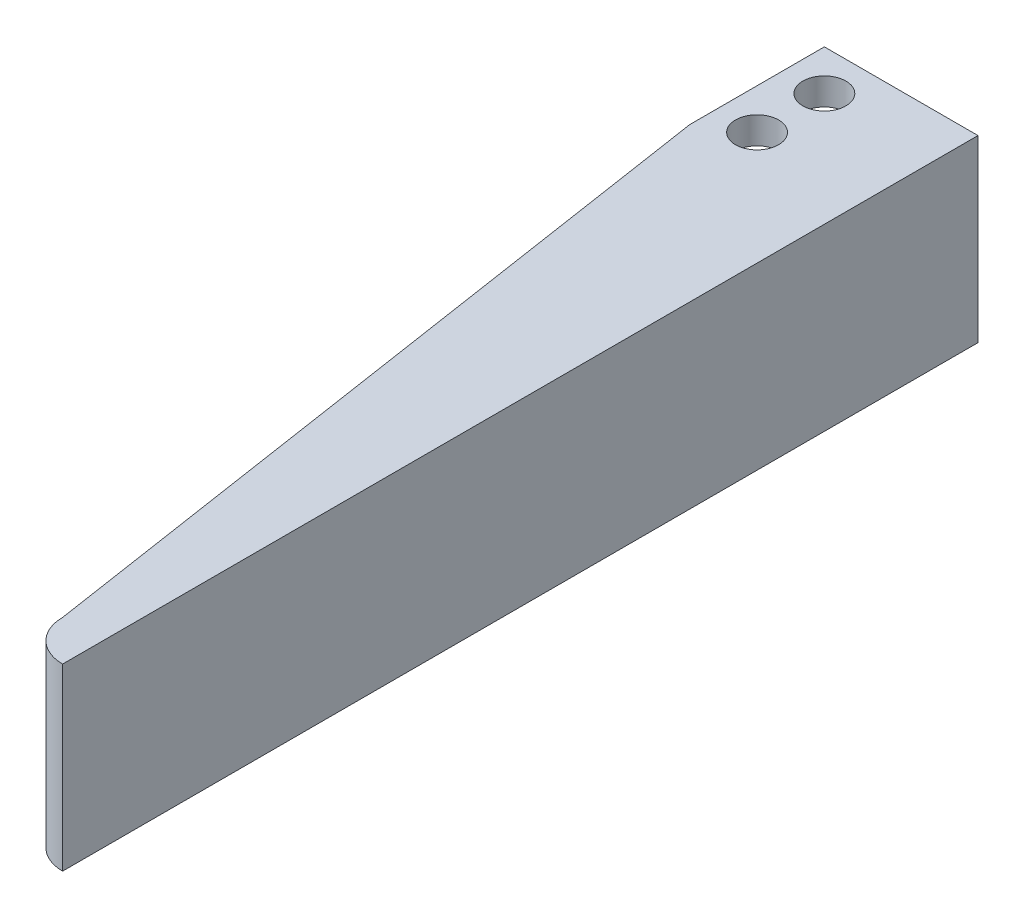
ISO-10303-21;
HEADER;
FILE_DESCRIPTION(('STEP AP214'),'2;1');
FILE_NAME('part.step','',(''),(''),'','','');
FILE_SCHEMA(('AUTOMOTIVE_DESIGN { 1 0 10303 214 1 1 1 1 }'));
ENDSEC;
DATA;
#1=APPLICATION_CONTEXT('core data for automotive mechanical design processes');
#2=APPLICATION_PROTOCOL_DEFINITION('international standard','automotive_design',2000,#1);
#3=PRODUCT_CONTEXT('',#1,'mechanical');
#4=PRODUCT('Part','Part','',(#3));
#5=PRODUCT_RELATED_PRODUCT_CATEGORY('part','',(#4));
#6=PRODUCT_DEFINITION_FORMATION('','',#4);
#7=PRODUCT_DEFINITION_CONTEXT('part definition',#1,'design');
#8=PRODUCT_DEFINITION('design','',#6,#7);
#9=PRODUCT_DEFINITION_SHAPE('','',#8);
#10=(LENGTH_UNIT() NAMED_UNIT(*) SI_UNIT(.MILLI.,.METRE.));
#11=(NAMED_UNIT(*) PLANE_ANGLE_UNIT() SI_UNIT($,.RADIAN.));
#12=(NAMED_UNIT(*) SI_UNIT($,.STERADIAN.) SOLID_ANGLE_UNIT());
#13=UNCERTAINTY_MEASURE_WITH_UNIT(LENGTH_MEASURE(1.E-05),#10,'distance_accuracy_value','');
#14=(GEOMETRIC_REPRESENTATION_CONTEXT(3) GLOBAL_UNCERTAINTY_ASSIGNED_CONTEXT((#13)) GLOBAL_UNIT_ASSIGNED_CONTEXT((#10,
#11,#12)) REPRESENTATION_CONTEXT('',''));
#15=CARTESIAN_POINT('',(0.,0.,0.));
#16=DIRECTION('',(0.,0.,1.));
#17=DIRECTION('',(1.,0.,0.));
#18=AXIS2_PLACEMENT_3D('',#15,#16,#17);
#19=CARTESIAN_POINT('',(5.70625000000002,0.,65.));
#20=DIRECTION('',(0.,1.,0.));
#21=DIRECTION('',(0.,0.,1.));
#22=AXIS2_PLACEMENT_3D('',#19,#20,#21);
#23=PLANE('',#22);
#24=CARTESIAN_POINT('',(-2.70625,0.,8.));
#25=DIRECTION('',(0.,1.,0.));
#26=DIRECTION('',(0.,0.,1.));
#27=AXIS2_PLACEMENT_3D('',#24,#25,#26);
#28=CIRCLE('',#27,1.6);
#29=CARTESIAN_POINT('',(-2.70625,0.,9.6));
#30=VERTEX_POINT('',#29);
#31=EDGE_CURVE('E136',#30,#30,#28,.T.);
#32=ORIENTED_EDGE('',*,*,#31,.T.);
#33=EDGE_LOOP('',(#32));
#34=FACE_BOUND('',#33,.T.);
#35=CARTESIAN_POINT('',(-2.70625,0.,3.));
#36=DIRECTION('',(0.,1.,0.));
#37=DIRECTION('',(0.,0.,1.));
#38=AXIS2_PLACEMENT_3D('',#35,#36,#37);
#39=CIRCLE('',#38,1.6);
#40=CARTESIAN_POINT('',(-2.70625,0.,4.6));
#41=VERTEX_POINT('',#40);
#42=EDGE_CURVE('E146',#41,#41,#39,.T.);
#43=ORIENTED_EDGE('',*,*,#42,.T.);
#44=EDGE_LOOP('',(#43));
#45=FACE_BOUND('',#44,.T.);
#46=DIRECTION('',(0.,0.,-1.));
#47=VECTOR('',#46,1.);
#48=CARTESIAN_POINT('',(2.70625000000002,0.,65.));
#49=LINE('',#48,#47);
#50=CARTESIAN_POINT('',(2.70625000000002,0.,65.));
#51=VERTEX_POINT('',#50);
#52=CARTESIAN_POINT('',(2.70625000000003,0.,0.));
#53=VERTEX_POINT('',#52);
#54=EDGE_CURVE('E66',#51,#53,#49,.T.);
#55=ORIENTED_EDGE('',*,*,#54,.F.);
#56=DIRECTION('',(0.151196146520445,0.,0.988503781114351));
#57=VECTOR('',#56,1.);
#58=CARTESIAN_POINT('',(-5.70625,0.,10.));
#59=LINE('',#58,#57);
#60=CARTESIAN_POINT('',(-5.70625,0.,10.));
#61=VERTEX_POINT('',#60);
#62=EDGE_CURVE('E119',#61,#51,#59,.T.);
#63=ORIENTED_EDGE('',*,*,#62,.F.);
#64=DIRECTION('',(0.,0.,1.));
#65=VECTOR('',#64,1.);
#66=CARTESIAN_POINT('',(-5.70625,0.,0.));
#67=LINE('',#66,#65);
#68=CARTESIAN_POINT('',(-5.70625,0.,0.));
#69=VERTEX_POINT('',#68);
#70=EDGE_CURVE('E116',#69,#61,#67,.T.);
#71=ORIENTED_EDGE('',*,*,#70,.F.);
#72=DIRECTION('',(-1.,0.,0.));
#73=VECTOR('',#72,1.);
#74=CARTESIAN_POINT('',(-5.70625,0.,0.));
#75=LINE('',#74,#73);
#76=EDGE_CURVE('E72',#53,#69,#75,.T.);
#77=ORIENTED_EDGE('',*,*,#76,.F.);
#78=EDGE_LOOP('',(#55,#63,#71,#77));
#79=FACE_BOUND('',#78,.T.);
#80=ADVANCED_FACE('F35',(#34,#45,#79),#23,.F.);
#81=CARTESIAN_POINT('',(5.70625000000002,2.,65.));
#82=DIRECTION('',(0.,1.,0.));
#83=DIRECTION('',(0.,0.,1.));
#84=AXIS2_PLACEMENT_3D('',#81,#82,#83);
#85=PLANE('',#84);
#86=CARTESIAN_POINT('',(-2.70625,2.,3.));
#87=DIRECTION('',(0.,1.,0.));
#88=DIRECTION('',(0.,0.,1.));
#89=AXIS2_PLACEMENT_3D('',#86,#87,#88);
#90=CIRCLE('',#89,1.6);
#91=CARTESIAN_POINT('',(-2.70625,2.,4.6));
#92=VERTEX_POINT('',#91);
#93=EDGE_CURVE('E120',#92,#92,#90,.T.);
#94=ORIENTED_EDGE('',*,*,#93,.F.);
#95=EDGE_LOOP('',(#94));
#96=FACE_BOUND('',#95,.T.);
#97=DIRECTION('',(0.,0.,1.));
#98=VECTOR('',#97,1.);
#99=CARTESIAN_POINT('',(-5.70625,2.,0.));
#100=LINE('',#99,#98);
#101=CARTESIAN_POINT('',(-5.70625,2.,0.));
#102=VERTEX_POINT('',#101);
#103=CARTESIAN_POINT('',(-5.70625,2.,10.));
#104=VERTEX_POINT('',#103);
#105=EDGE_CURVE('E123',#102,#104,#100,.T.);
#106=ORIENTED_EDGE('',*,*,#105,.T.);
#107=DIRECTION('',(0.151196146520445,0.,0.988503781114351));
#108=VECTOR('',#107,1.);
#109=CARTESIAN_POINT('',(-5.70625,2.,10.));
#110=LINE('',#109,#108);
#111=CARTESIAN_POINT('',(2.70625000000002,2.,65.));
#112=VERTEX_POINT('',#111);
#113=EDGE_CURVE('E80',#104,#112,#110,.T.);
#114=ORIENTED_EDGE('',*,*,#113,.T.);
#115=CARTESIAN_POINT('',(5.70625000000002,2.,65.));
#116=DIRECTION('',(0.,1.,0.));
#117=DIRECTION('',(0.,0.,1.));
#118=AXIS2_PLACEMENT_3D('',#115,#116,#117);
#119=CIRCLE('',#118,3.);
#120=CARTESIAN_POINT('',(5.70625000000001,2.,68.));
#121=VERTEX_POINT('',#120);
#122=EDGE_CURVE('E86',#112,#121,#119,.T.);
#123=ORIENTED_EDGE('',*,*,#122,.T.);
#124=DIRECTION('',(0.,0.,-1.));
#125=VECTOR('',#124,1.);
#126=CARTESIAN_POINT('',(5.70625000000001,2.,68.));
#127=LINE('',#126,#125);
#128=CARTESIAN_POINT('',(5.70625,2.,0.));
#129=VERTEX_POINT('',#128);
#130=EDGE_CURVE('E91',#121,#129,#127,.T.);
#131=ORIENTED_EDGE('',*,*,#130,.T.);
#132=DIRECTION('',(-1.,0.,0.));
#133=VECTOR('',#132,1.);
#134=CARTESIAN_POINT('',(-5.70625,2.,0.));
#135=LINE('',#134,#133);
#136=EDGE_CURVE('E52',#129,#102,#135,.T.);
#137=ORIENTED_EDGE('',*,*,#136,.T.);
#138=EDGE_LOOP('',(#106,#114,#123,#131,#137));
#139=FACE_BOUND('',#138,.T.);
#140=CARTESIAN_POINT('',(-2.70625,2.,8.));
#141=DIRECTION('',(0.,1.,0.));
#142=DIRECTION('',(0.,0.,1.));
#143=AXIS2_PLACEMENT_3D('',#140,#141,#142);
#144=CIRCLE('',#143,1.6);
#145=CARTESIAN_POINT('',(-2.70625,2.,9.6));
#146=VERTEX_POINT('',#145);
#147=EDGE_CURVE('E140',#146,#146,#144,.T.);
#148=ORIENTED_EDGE('',*,*,#147,.F.);
#149=EDGE_LOOP('',(#148));
#150=FACE_BOUND('',#149,.T.);
#151=ADVANCED_FACE('F88',(#96,#139,#150),#85,.T.);
#152=CARTESIAN_POINT('',(-5.70625,2.,0.));
#153=DIRECTION('',(1.,0.,0.));
#154=DIRECTION('',(0.,0.,-1.));
#155=AXIS2_PLACEMENT_3D('',#152,#153,#154);
#156=PLANE('',#155);
#157=ORIENTED_EDGE('',*,*,#70,.T.);
#158=DIRECTION('',(0.,-1.,0.));
#159=VECTOR('',#158,1.);
#160=CARTESIAN_POINT('',(-5.70625,2.,10.));
#161=LINE('',#160,#159);
#162=EDGE_CURVE('E11',#104,#61,#161,.T.);
#163=ORIENTED_EDGE('',*,*,#162,.F.);
#164=ORIENTED_EDGE('',*,*,#105,.F.);
#165=DIRECTION('',(0.,-1.,0.));
#166=VECTOR('',#165,1.);
#167=CARTESIAN_POINT('',(-5.70625,2.,0.));
#168=LINE('',#167,#166);
#169=EDGE_CURVE('E112',#102,#69,#168,.T.);
#170=ORIENTED_EDGE('',*,*,#169,.T.);
#171=EDGE_LOOP('',(#157,#163,#164,#170));
#172=FACE_BOUND('',#171,.T.);
#173=ADVANCED_FACE('F37',(#172),#156,.F.);
#174=CARTESIAN_POINT('',(-5.70625,2.,10.));
#175=DIRECTION('',(0.988503781114351,0.,-0.151196146520445));
#176=DIRECTION('',(-0.151196146520445,0.,-0.988503781114351));
#177=AXIS2_PLACEMENT_3D('',#174,#175,#176);
#178=PLANE('',#177);
#179=ORIENTED_EDGE('',*,*,#62,.T.);
#180=DIRECTION('',(0.,-1.,0.));
#181=VECTOR('',#180,1.);
#182=CARTESIAN_POINT('',(2.70625000000002,2.,65.));
#183=LINE('',#182,#181);
#184=EDGE_CURVE('E44',#112,#51,#183,.T.);
#185=ORIENTED_EDGE('',*,*,#184,.F.);
#186=ORIENTED_EDGE('',*,*,#113,.F.);
#187=ORIENTED_EDGE('',*,*,#162,.T.);
#188=EDGE_LOOP('',(#179,#185,#186,#187));
#189=FACE_BOUND('',#188,.T.);
#190=ADVANCED_FACE('F156',(#189),#178,.F.);
#191=CARTESIAN_POINT('',(5.70625000000002,2.,65.));
#192=DIRECTION('',(0.,-1.,0.));
#193=DIRECTION('',(0.,0.,-1.));
#194=AXIS2_PLACEMENT_3D('',#191,#192,#193);
#195=CYLINDRICAL_SURFACE('',#194,3.);
#196=ORIENTED_EDGE('',*,*,#184,.T.);
#197=DIRECTION('',(0.,1.,0.));
#198=VECTOR('',#197,1.);
#199=CARTESIAN_POINT('',(2.70625000000002,-4.6625,65.));
#200=LINE('',#199,#198);
#201=CARTESIAN_POINT('',(2.70625000000002,-9.325,65.));
#202=VERTEX_POINT('',#201);
#203=EDGE_CURVE('E128',#202,#51,#200,.T.);
#204=ORIENTED_EDGE('',*,*,#203,.F.);
#205=DIRECTION('',(0.,1.,0.));
#206=VECTOR('',#205,1.);
#207=CARTESIAN_POINT('',(2.70625000000002,-11.325,65.));
#208=LINE('',#207,#206);
#209=CARTESIAN_POINT('',(2.70625000000002,-11.325,65.));
#210=VERTEX_POINT('',#209);
#211=EDGE_CURVE('E189',#210,#202,#208,.T.);
#212=ORIENTED_EDGE('',*,*,#211,.F.);
#213=CARTESIAN_POINT('',(5.70625000000002,-11.325,65.));
#214=DIRECTION('',(0.,1.,0.));
#215=DIRECTION('',(0.,0.,1.));
#216=AXIS2_PLACEMENT_3D('',#213,#214,#215);
#217=CIRCLE('',#216,3.);
#218=CARTESIAN_POINT('',(5.70625000000001,-11.325,68.));
#219=VERTEX_POINT('',#218);
#220=EDGE_CURVE('E103',#210,#219,#217,.T.);
#221=ORIENTED_EDGE('',*,*,#220,.T.);
#222=DIRECTION('',(0.,-1.,0.));
#223=VECTOR('',#222,1.);
#224=CARTESIAN_POINT('',(5.70625000000001,2.,68.));
#225=LINE('',#224,#223);
#226=EDGE_CURVE('E98',#121,#219,#225,.T.);
#227=ORIENTED_EDGE('',*,*,#226,.F.);
#228=ORIENTED_EDGE('',*,*,#122,.F.);
#229=EDGE_LOOP('',(#196,#204,#212,#221,#227,#228));
#230=FACE_BOUND('',#229,.T.);
#231=ADVANCED_FACE('F99',(#230),#195,.T.);
#232=CARTESIAN_POINT('',(5.70625000000001,2.,68.));
#233=DIRECTION('',(-1.,0.,0.));
#234=DIRECTION('',(0.,0.,1.));
#235=AXIS2_PLACEMENT_3D('',#232,#233,#234);
#236=PLANE('',#235);
#237=ORIENTED_EDGE('',*,*,#226,.T.);
#238=DIRECTION('',(0.,0.,-1.));
#239=VECTOR('',#238,1.);
#240=CARTESIAN_POINT('',(5.70625000000001,-11.325,68.));
#241=LINE('',#240,#239);
#242=CARTESIAN_POINT('',(5.70625,-11.325,0.));
#243=VERTEX_POINT('',#242);
#244=EDGE_CURVE('E200',#219,#243,#241,.T.);
#245=ORIENTED_EDGE('',*,*,#244,.T.);
#246=DIRECTION('',(0.,-1.,0.));
#247=VECTOR('',#246,1.);
#248=CARTESIAN_POINT('',(5.70625,2.,0.));
#249=LINE('',#248,#247);
#250=EDGE_CURVE('E107',#129,#243,#249,.T.);
#251=ORIENTED_EDGE('',*,*,#250,.F.);
#252=ORIENTED_EDGE('',*,*,#130,.F.);
#253=EDGE_LOOP('',(#237,#245,#251,#252));
#254=FACE_BOUND('',#253,.T.);
#255=ADVANCED_FACE('F109',(#254),#236,.F.);
#256=CARTESIAN_POINT('',(-5.70625,2.,0.));
#257=DIRECTION('',(0.,0.,1.));
#258=DIRECTION('',(1.,0.,0.));
#259=AXIS2_PLACEMENT_3D('',#256,#257,#258);
#260=PLANE('',#259);
#261=ORIENTED_EDGE('',*,*,#250,.T.);
#262=DIRECTION('',(-1.,0.,0.));
#263=VECTOR('',#262,1.);
#264=CARTESIAN_POINT('',(-5.70625,-11.325,0.));
#265=LINE('',#264,#263);
#266=CARTESIAN_POINT('',(-5.70625,-11.325,0.));
#267=VERTEX_POINT('',#266);
#268=EDGE_CURVE('E194',#243,#267,#265,.T.);
#269=ORIENTED_EDGE('',*,*,#268,.T.);
#270=DIRECTION('',(0.,1.,0.));
#271=VECTOR('',#270,1.);
#272=CARTESIAN_POINT('',(-5.70625,-11.325,0.));
#273=LINE('',#272,#271);
#274=CARTESIAN_POINT('',(-5.70625,-9.325,0.));
#275=VERTEX_POINT('',#274);
#276=EDGE_CURVE('E180',#267,#275,#273,.T.);
#277=ORIENTED_EDGE('',*,*,#276,.T.);
#278=DIRECTION('',(-1.,0.,0.));
#279=VECTOR('',#278,1.);
#280=CARTESIAN_POINT('',(-5.70625,-9.325,0.));
#281=LINE('',#280,#279);
#282=CARTESIAN_POINT('',(2.70625000000002,-9.325,0.));
#283=VERTEX_POINT('',#282);
#284=EDGE_CURVE('E209',#283,#275,#281,.T.);
#285=ORIENTED_EDGE('',*,*,#284,.F.);
#286=DIRECTION('',(0.,1.,0.));
#287=VECTOR('',#286,1.);
#288=CARTESIAN_POINT('',(2.70625000000003,-4.6625,0.));
#289=LINE('',#288,#287);
#290=EDGE_CURVE('E137',#283,#53,#289,.T.);
#291=ORIENTED_EDGE('',*,*,#290,.T.);
#292=ORIENTED_EDGE('',*,*,#76,.T.);
#293=ORIENTED_EDGE('',*,*,#169,.F.);
#294=ORIENTED_EDGE('',*,*,#136,.F.);
#295=EDGE_LOOP('',(#261,#269,#277,#285,#291,#292,#293,#294));
#296=FACE_BOUND('',#295,.T.);
#297=ADVANCED_FACE('F199',(#296),#260,.F.);
#298=CARTESIAN_POINT('',(-2.70625,2.,3.));
#299=DIRECTION('',(0.,-1.,0.));
#300=DIRECTION('',(0.,0.,-1.));
#301=AXIS2_PLACEMENT_3D('',#298,#299,#300);
#302=CYLINDRICAL_SURFACE('',#301,1.6);
#303=ORIENTED_EDGE('',*,*,#93,.T.);
#304=EDGE_LOOP('',(#303));
#305=FACE_BOUND('',#304,.T.);
#306=ORIENTED_EDGE('',*,*,#42,.F.);
#307=EDGE_LOOP('',(#306));
#308=FACE_BOUND('',#307,.T.);
#309=ADVANCED_FACE('F245',(#305,#308),#302,.F.);
#310=CARTESIAN_POINT('',(-2.70625,2.,8.));
#311=DIRECTION('',(0.,-1.,0.));
#312=DIRECTION('',(0.,0.,-1.));
#313=AXIS2_PLACEMENT_3D('',#310,#311,#312);
#314=CYLINDRICAL_SURFACE('',#313,1.6);
#315=ORIENTED_EDGE('',*,*,#147,.T.);
#316=EDGE_LOOP('',(#315));
#317=FACE_BOUND('',#316,.T.);
#318=ORIENTED_EDGE('',*,*,#31,.F.);
#319=EDGE_LOOP('',(#318));
#320=FACE_BOUND('',#319,.T.);
#321=ADVANCED_FACE('F299',(#317,#320),#314,.F.);
#322=CARTESIAN_POINT('',(2.70625000000002,-4.6625,65.));
#323=DIRECTION('',(1.,0.,0.));
#324=DIRECTION('',(0.,0.,-1.));
#325=AXIS2_PLACEMENT_3D('',#322,#323,#324);
#326=PLANE('',#325);
#327=ORIENTED_EDGE('',*,*,#54,.T.);
#328=ORIENTED_EDGE('',*,*,#290,.F.);
#329=DIRECTION('',(0.,0.,-1.));
#330=VECTOR('',#329,1.);
#331=CARTESIAN_POINT('',(2.70625000000002,-9.325,65.));
#332=LINE('',#331,#330);
#333=EDGE_CURVE('E134',#202,#283,#332,.T.);
#334=ORIENTED_EDGE('',*,*,#333,.F.);
#335=ORIENTED_EDGE('',*,*,#203,.T.);
#336=EDGE_LOOP('',(#327,#328,#334,#335));
#337=FACE_BOUND('',#336,.T.);
#338=ADVANCED_FACE('F131',(#337),#326,.F.);
#339=CARTESIAN_POINT('',(5.70625000000002,-9.325,65.));
#340=DIRECTION('',(0.,-1.,0.));
#341=DIRECTION('',(0.,0.,1.));
#342=AXIS2_PLACEMENT_3D('',#339,#340,#341);
#343=PLANE('',#342);
#344=CARTESIAN_POINT('',(-2.70625,-9.325,8.));
#345=DIRECTION('',(0.,1.,0.));
#346=DIRECTION('',(0.,0.,1.));
#347=AXIS2_PLACEMENT_3D('',#344,#345,#346);
#348=CIRCLE('',#347,1.6);
#349=CARTESIAN_POINT('',(-2.70625,-9.325,9.6));
#350=VERTEX_POINT('',#349);
#351=EDGE_CURVE('E368',#350,#350,#348,.T.);
#352=ORIENTED_EDGE('',*,*,#351,.F.);
#353=EDGE_LOOP('',(#352));
#354=FACE_BOUND('',#353,.T.);
#355=CARTESIAN_POINT('',(-2.70625,-9.325,3.));
#356=DIRECTION('',(0.,1.,0.));
#357=DIRECTION('',(0.,0.,1.));
#358=AXIS2_PLACEMENT_3D('',#355,#356,#357);
#359=CIRCLE('',#358,1.6);
#360=CARTESIAN_POINT('',(-2.70625,-9.325,4.6));
#361=VERTEX_POINT('',#360);
#362=EDGE_CURVE('E370',#361,#361,#359,.T.);
#363=ORIENTED_EDGE('',*,*,#362,.F.);
#364=EDGE_LOOP('',(#363));
#365=FACE_BOUND('',#364,.T.);
#366=DIRECTION('',(0.151196146520445,0.,0.988503781114351));
#367=VECTOR('',#366,1.);
#368=CARTESIAN_POINT('',(-5.70625,-9.325,10.));
#369=LINE('',#368,#367);
#370=CARTESIAN_POINT('',(-5.70625,-9.325,10.));
#371=VERTEX_POINT('',#370);
#372=EDGE_CURVE('E197',#371,#202,#369,.T.);
#373=ORIENTED_EDGE('',*,*,#372,.T.);
#374=ORIENTED_EDGE('',*,*,#333,.T.);
#375=ORIENTED_EDGE('',*,*,#284,.T.);
#376=DIRECTION('',(0.,0.,1.));
#377=VECTOR('',#376,1.);
#378=CARTESIAN_POINT('',(-5.70625,-9.325,0.));
#379=LINE('',#378,#377);
#380=EDGE_CURVE('E186',#275,#371,#379,.T.);
#381=ORIENTED_EDGE('',*,*,#380,.T.);
#382=EDGE_LOOP('',(#373,#374,#375,#381));
#383=FACE_BOUND('',#382,.T.);
#384=ADVANCED_FACE('F217',(#354,#365,#383),#343,.F.);
#385=CARTESIAN_POINT('',(-5.70625,-11.325,0.));
#386=DIRECTION('',(-1.,0.,0.));
#387=DIRECTION('',(0.,0.,1.));
#388=AXIS2_PLACEMENT_3D('',#385,#386,#387);
#389=PLANE('',#388);
#390=ORIENTED_EDGE('',*,*,#380,.F.);
#391=ORIENTED_EDGE('',*,*,#276,.F.);
#392=DIRECTION('',(0.,0.,1.));
#393=VECTOR('',#392,1.);
#394=CARTESIAN_POINT('',(-5.70625,-11.325,0.));
#395=LINE('',#394,#393);
#396=CARTESIAN_POINT('',(-5.70625,-11.325,10.));
#397=VERTEX_POINT('',#396);
#398=EDGE_CURVE('E183',#267,#397,#395,.T.);
#399=ORIENTED_EDGE('',*,*,#398,.T.);
#400=DIRECTION('',(0.,1.,0.));
#401=VECTOR('',#400,1.);
#402=CARTESIAN_POINT('',(-5.70625,-11.325,10.));
#403=LINE('',#402,#401);
#404=EDGE_CURVE('E207',#397,#371,#403,.T.);
#405=ORIENTED_EDGE('',*,*,#404,.T.);
#406=EDGE_LOOP('',(#390,#391,#399,#405));
#407=FACE_BOUND('',#406,.T.);
#408=ADVANCED_FACE('F182',(#407),#389,.T.);
#409=CARTESIAN_POINT('',(-5.70625,-11.325,10.));
#410=DIRECTION('',(-0.988503781114351,0.,0.151196146520445));
#411=DIRECTION('',(0.151196146520445,0.,0.988503781114351));
#412=AXIS2_PLACEMENT_3D('',#409,#410,#411);
#413=PLANE('',#412);
#414=ORIENTED_EDGE('',*,*,#372,.F.);
#415=ORIENTED_EDGE('',*,*,#404,.F.);
#416=DIRECTION('',(0.151196146520445,0.,0.988503781114351));
#417=VECTOR('',#416,1.);
#418=CARTESIAN_POINT('',(-5.70625,-11.325,10.));
#419=LINE('',#418,#417);
#420=EDGE_CURVE('E196',#397,#210,#419,.T.);
#421=ORIENTED_EDGE('',*,*,#420,.T.);
#422=ORIENTED_EDGE('',*,*,#211,.T.);
#423=EDGE_LOOP('',(#414,#415,#421,#422));
#424=FACE_BOUND('',#423,.T.);
#425=ADVANCED_FACE('F220',(#424),#413,.T.);
#426=CARTESIAN_POINT('',(5.70625000000002,-11.325,65.));
#427=DIRECTION('',(0.,-1.,0.));
#428=DIRECTION('',(0.,0.,1.));
#429=AXIS2_PLACEMENT_3D('',#426,#427,#428);
#430=PLANE('',#429);
#431=CARTESIAN_POINT('',(-2.70625,-11.325,8.));
#432=DIRECTION('',(0.,1.,0.));
#433=DIRECTION('',(0.,0.,1.));
#434=AXIS2_PLACEMENT_3D('',#431,#432,#433);
#435=CIRCLE('',#434,1.6);
#436=CARTESIAN_POINT('',(-2.70625,-11.325,9.6));
#437=VERTEX_POINT('',#436);
#438=EDGE_CURVE('E365',#437,#437,#435,.T.);
#439=ORIENTED_EDGE('',*,*,#438,.T.);
#440=EDGE_LOOP('',(#439));
#441=FACE_BOUND('',#440,.T.);
#442=CARTESIAN_POINT('',(-2.70625,-11.325,3.));
#443=DIRECTION('',(0.,1.,0.));
#444=DIRECTION('',(0.,0.,1.));
#445=AXIS2_PLACEMENT_3D('',#442,#443,#444);
#446=CIRCLE('',#445,1.6);
#447=CARTESIAN_POINT('',(-2.70625,-11.325,4.6));
#448=VERTEX_POINT('',#447);
#449=EDGE_CURVE('E210',#448,#448,#446,.T.);
#450=ORIENTED_EDGE('',*,*,#449,.T.);
#451=EDGE_LOOP('',(#450));
#452=FACE_BOUND('',#451,.T.);
#453=ORIENTED_EDGE('',*,*,#398,.F.);
#454=ORIENTED_EDGE('',*,*,#268,.F.);
#455=ORIENTED_EDGE('',*,*,#244,.F.);
#456=ORIENTED_EDGE('',*,*,#220,.F.);
#457=ORIENTED_EDGE('',*,*,#420,.F.);
#458=EDGE_LOOP('',(#453,#454,#455,#456,#457));
#459=FACE_BOUND('',#458,.T.);
#460=ADVANCED_FACE('F193',(#441,#452,#459),#430,.T.);
#461=CARTESIAN_POINT('',(-2.70625,-11.325,3.));
#462=DIRECTION('',(0.,1.,0.));
#463=DIRECTION('',(0.,0.,1.));
#464=AXIS2_PLACEMENT_3D('',#461,#462,#463);
#465=CYLINDRICAL_SURFACE('',#464,1.6);
#466=ORIENTED_EDGE('',*,*,#449,.F.);
#467=EDGE_LOOP('',(#466));
#468=FACE_BOUND('',#467,.T.);
#469=ORIENTED_EDGE('',*,*,#362,.T.);
#470=EDGE_LOOP('',(#469));
#471=FACE_BOUND('',#470,.T.);
#472=ADVANCED_FACE('F227',(#468,#471),#465,.F.);
#473=CARTESIAN_POINT('',(-2.70625,-11.325,8.));
#474=DIRECTION('',(0.,1.,0.));
#475=DIRECTION('',(0.,0.,1.));
#476=AXIS2_PLACEMENT_3D('',#473,#474,#475);
#477=CYLINDRICAL_SURFACE('',#476,1.6);
#478=ORIENTED_EDGE('',*,*,#438,.F.);
#479=EDGE_LOOP('',(#478));
#480=FACE_BOUND('',#479,.T.);
#481=ORIENTED_EDGE('',*,*,#351,.T.);
#482=EDGE_LOOP('',(#481));
#483=FACE_BOUND('',#482,.T.);
#484=ADVANCED_FACE('F348',(#480,#483),#477,.F.);
#485=CLOSED_SHELL('',(#80,#151,#173,#190,#231,#255,#297,#309,#321,#338,#384,#408,#425,#460,#472,#484));
#486=MANIFOLD_SOLID_BREP('B2',#485);
#487=ADVANCED_BREP_SHAPE_REPRESENTATION('',(#18,#486),#14);
#488=SHAPE_DEFINITION_REPRESENTATION(#9,#487);
ENDSEC;
END-ISO-10303-21;
